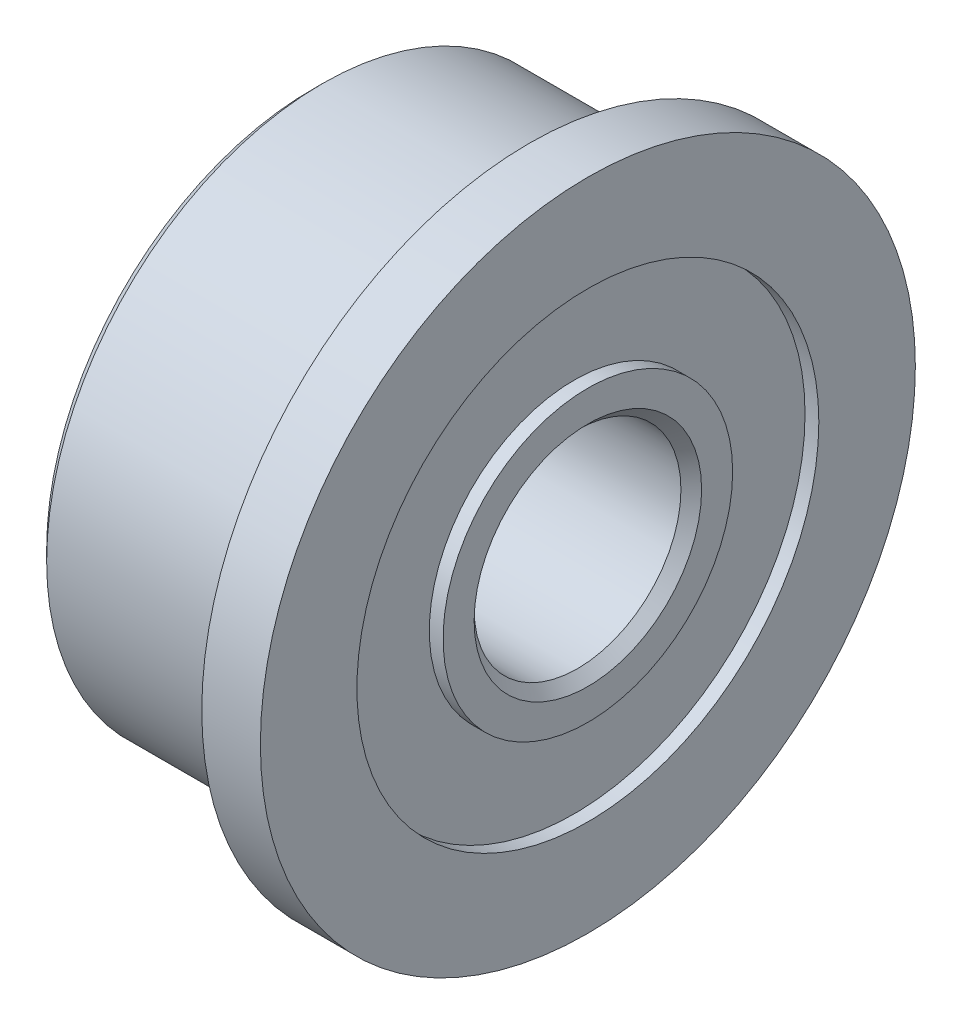
ISO-10303-21;
HEADER;
FILE_DESCRIPTION(('STEP AP214'),'2;1');
FILE_NAME('part.step','',(''),(''),'','','');
FILE_SCHEMA(('AUTOMOTIVE_DESIGN { 1 0 10303 214 1 1 1 1 }'));
ENDSEC;
DATA;
#1=APPLICATION_CONTEXT('core data for automotive mechanical design processes');
#2=APPLICATION_PROTOCOL_DEFINITION('international standard','automotive_design',2000,#1);
#3=PRODUCT_CONTEXT('',#1,'mechanical');
#4=PRODUCT('Part','Part','',(#3));
#5=PRODUCT_RELATED_PRODUCT_CATEGORY('part','',(#4));
#6=PRODUCT_DEFINITION_FORMATION('','',#4);
#7=PRODUCT_DEFINITION_CONTEXT('part definition',#1,'design');
#8=PRODUCT_DEFINITION('design','',#6,#7);
#9=PRODUCT_DEFINITION_SHAPE('','',#8);
#10=(LENGTH_UNIT() NAMED_UNIT(*) SI_UNIT(.MILLI.,.METRE.));
#11=(NAMED_UNIT(*) PLANE_ANGLE_UNIT() SI_UNIT($,.RADIAN.));
#12=(NAMED_UNIT(*) SI_UNIT($,.STERADIAN.) SOLID_ANGLE_UNIT());
#13=UNCERTAINTY_MEASURE_WITH_UNIT(LENGTH_MEASURE(1.E-05),#10,'distance_accuracy_value','');
#14=(GEOMETRIC_REPRESENTATION_CONTEXT(3) GLOBAL_UNCERTAINTY_ASSIGNED_CONTEXT((#13)) GLOBAL_UNIT_ASSIGNED_CONTEXT((#10,
#11,#12)) REPRESENTATION_CONTEXT('',''));
#15=CARTESIAN_POINT('',(0.,0.,0.));
#16=DIRECTION('',(0.,0.,1.));
#17=DIRECTION('',(1.,0.,0.));
#18=AXIS2_PLACEMENT_3D('',#15,#16,#17);
#19=CARTESIAN_POINT('',(-4.,2.1,0.));
#20=DIRECTION('',(-1.,0.,0.));
#21=DIRECTION('',(0.,0.,1.));
#22=AXIS2_PLACEMENT_3D('',#19,#20,#21);
#23=PLANE('',#22);
#24=CARTESIAN_POINT('',(-4.,0.,0.));
#25=DIRECTION('',(-1.,0.,0.));
#26=DIRECTION('',(0.,0.,1.));
#27=AXIS2_PLACEMENT_3D('',#24,#25,#26);
#28=CIRCLE('',#27,1.65);
#29=CARTESIAN_POINT('',(-4.,0.,1.65));
#30=VERTEX_POINT('',#29);
#31=EDGE_CURVE('E42',#30,#30,#28,.F.);
#32=ORIENTED_EDGE('',*,*,#31,.T.);
#33=EDGE_LOOP('',(#32));
#34=FACE_BOUND('',#33,.T.);
#35=CARTESIAN_POINT('',(-4.,0.,0.));
#36=DIRECTION('',(1.,0.,0.));
#37=DIRECTION('',(0.,0.,-1.));
#38=AXIS2_PLACEMENT_3D('',#35,#36,#37);
#39=CIRCLE('',#38,2.1);
#40=CARTESIAN_POINT('',(-4.,0.,-2.1));
#41=VERTEX_POINT('',#40);
#42=EDGE_CURVE('E90',#41,#41,#39,.T.);
#43=ORIENTED_EDGE('',*,*,#42,.F.);
#44=EDGE_LOOP('',(#43));
#45=FACE_BOUND('',#44,.T.);
#46=ADVANCED_FACE('F31',(#34,#45),#23,.T.);
#47=CARTESIAN_POINT('',(0.,0.,0.));
#48=DIRECTION('',(1.,0.,0.));
#49=DIRECTION('',(0.,0.,-1.));
#50=AXIS2_PLACEMENT_3D('',#47,#48,#49);
#51=CYLINDRICAL_SURFACE('',#50,1.5);
#52=CARTESIAN_POINT('',(-0.150000000000001,0.,0.));
#53=DIRECTION('',(1.,0.,0.));
#54=DIRECTION('',(0.,0.,-1.));
#55=AXIS2_PLACEMENT_3D('',#52,#53,#54);
#56=CIRCLE('',#55,1.5);
#57=CARTESIAN_POINT('',(-0.150000000000001,0.,-1.5));
#58=VERTEX_POINT('',#57);
#59=EDGE_CURVE('E51',#58,#58,#56,.T.);
#60=ORIENTED_EDGE('',*,*,#59,.T.);
#61=EDGE_LOOP('',(#60));
#62=FACE_BOUND('',#61,.T.);
#63=CARTESIAN_POINT('',(-3.85,0.,0.));
#64=DIRECTION('',(-1.,0.,0.));
#65=DIRECTION('',(0.,0.,1.));
#66=AXIS2_PLACEMENT_3D('',#63,#64,#65);
#67=CIRCLE('',#66,1.5);
#68=CARTESIAN_POINT('',(-3.85,0.,1.5));
#69=VERTEX_POINT('',#68);
#70=EDGE_CURVE('E54',#69,#69,#67,.T.);
#71=ORIENTED_EDGE('',*,*,#70,.T.);
#72=EDGE_LOOP('',(#71));
#73=FACE_BOUND('',#72,.T.);
#74=ADVANCED_FACE('F98',(#62,#73),#51,.F.);
#75=CARTESIAN_POINT('',(0.,1.5,0.));
#76=DIRECTION('',(1.,0.,0.));
#77=DIRECTION('',(0.,0.,-1.));
#78=AXIS2_PLACEMENT_3D('',#75,#76,#77);
#79=PLANE('',#78);
#80=CARTESIAN_POINT('',(0.,0.,0.));
#81=DIRECTION('',(1.,0.,0.));
#82=DIRECTION('',(0.,0.,-1.));
#83=AXIS2_PLACEMENT_3D('',#80,#81,#82);
#84=CIRCLE('',#83,1.65);
#85=CARTESIAN_POINT('',(0.,0.,-1.65));
#86=VERTEX_POINT('',#85);
#87=EDGE_CURVE('E46',#86,#86,#84,.F.);
#88=ORIENTED_EDGE('',*,*,#87,.T.);
#89=EDGE_LOOP('',(#88));
#90=FACE_BOUND('',#89,.T.);
#91=CARTESIAN_POINT('',(0.,0.,0.));
#92=DIRECTION('',(1.,0.,0.));
#93=DIRECTION('',(0.,0.,-1.));
#94=AXIS2_PLACEMENT_3D('',#91,#92,#93);
#95=CIRCLE('',#94,2.1);
#96=CARTESIAN_POINT('',(0.,0.,-2.1));
#97=VERTEX_POINT('',#96);
#98=EDGE_CURVE('E57',#97,#97,#95,.T.);
#99=ORIENTED_EDGE('',*,*,#98,.T.);
#100=EDGE_LOOP('',(#99));
#101=FACE_BOUND('',#100,.T.);
#102=ADVANCED_FACE('F104',(#90,#101),#79,.T.);
#103=CARTESIAN_POINT('',(0.,0.,0.));
#104=DIRECTION('',(1.,0.,0.));
#105=DIRECTION('',(0.,0.,-1.));
#106=AXIS2_PLACEMENT_3D('',#103,#104,#105);
#107=CYLINDRICAL_SURFACE('',#106,2.1);
#108=CARTESIAN_POINT('',(-0.2,0.,0.));
#109=DIRECTION('',(1.,0.,0.));
#110=DIRECTION('',(0.,0.,-1.));
#111=AXIS2_PLACEMENT_3D('',#108,#109,#110);
#112=CIRCLE('',#111,2.1);
#113=CARTESIAN_POINT('',(-0.2,0.,-2.1));
#114=VERTEX_POINT('',#113);
#115=EDGE_CURVE('E60',#114,#114,#112,.T.);
#116=ORIENTED_EDGE('',*,*,#115,.T.);
#117=EDGE_LOOP('',(#116));
#118=FACE_BOUND('',#117,.T.);
#119=ORIENTED_EDGE('',*,*,#98,.F.);
#120=EDGE_LOOP('',(#119));
#121=FACE_BOUND('',#120,.T.);
#122=ADVANCED_FACE('F171',(#118,#121),#107,.T.);
#123=CARTESIAN_POINT('',(-0.2,3.35,0.));
#124=DIRECTION('',(1.,0.,0.));
#125=DIRECTION('',(0.,0.,-1.));
#126=AXIS2_PLACEMENT_3D('',#123,#124,#125);
#127=PLANE('',#126);
#128=CARTESIAN_POINT('',(-0.2,0.,0.));
#129=DIRECTION('',(1.,0.,0.));
#130=DIRECTION('',(0.,0.,-1.));
#131=AXIS2_PLACEMENT_3D('',#128,#129,#130);
#132=CIRCLE('',#131,3.35);
#133=CARTESIAN_POINT('',(-0.2,0.,-3.35));
#134=VERTEX_POINT('',#133);
#135=EDGE_CURVE('E63',#134,#134,#132,.T.);
#136=ORIENTED_EDGE('',*,*,#135,.T.);
#137=EDGE_LOOP('',(#136));
#138=FACE_BOUND('',#137,.T.);
#139=ORIENTED_EDGE('',*,*,#115,.F.);
#140=EDGE_LOOP('',(#139));
#141=FACE_BOUND('',#140,.T.);
#142=ADVANCED_FACE('F253',(#138,#141),#127,.T.);
#143=CARTESIAN_POINT('',(0.,0.,0.));
#144=DIRECTION('',(1.,0.,0.));
#145=DIRECTION('',(0.,0.,-1.));
#146=AXIS2_PLACEMENT_3D('',#143,#144,#145);
#147=CYLINDRICAL_SURFACE('',#146,3.35);
#148=CARTESIAN_POINT('',(0.,0.,0.));
#149=DIRECTION('',(1.,0.,0.));
#150=DIRECTION('',(0.,0.,-1.));
#151=AXIS2_PLACEMENT_3D('',#148,#149,#150);
#152=CIRCLE('',#151,3.35);
#153=CARTESIAN_POINT('',(0.,0.,-3.35));
#154=VERTEX_POINT('',#153);
#155=EDGE_CURVE('E66',#154,#154,#152,.T.);
#156=ORIENTED_EDGE('',*,*,#155,.T.);
#157=EDGE_LOOP('',(#156));
#158=FACE_BOUND('',#157,.T.);
#159=ORIENTED_EDGE('',*,*,#135,.F.);
#160=EDGE_LOOP('',(#159));
#161=FACE_BOUND('',#160,.T.);
#162=ADVANCED_FACE('F243',(#158,#161),#147,.F.);
#163=CARTESIAN_POINT('',(0.,3.35,0.));
#164=DIRECTION('',(1.,0.,0.));
#165=DIRECTION('',(0.,0.,-1.));
#166=AXIS2_PLACEMENT_3D('',#163,#164,#165);
#167=PLANE('',#166);
#168=CARTESIAN_POINT('',(0.,0.,0.));
#169=DIRECTION('',(1.,0.,0.));
#170=DIRECTION('',(0.,0.,-1.));
#171=AXIS2_PLACEMENT_3D('',#168,#169,#170);
#172=CIRCLE('',#171,4.75);
#173=CARTESIAN_POINT('',(0.,0.,-4.75));
#174=VERTEX_POINT('',#173);
#175=EDGE_CURVE('E69',#174,#174,#172,.T.);
#176=ORIENTED_EDGE('',*,*,#175,.T.);
#177=EDGE_LOOP('',(#176));
#178=FACE_BOUND('',#177,.T.);
#179=ORIENTED_EDGE('',*,*,#155,.F.);
#180=EDGE_LOOP('',(#179));
#181=FACE_BOUND('',#180,.T.);
#182=ADVANCED_FACE('F233',(#178,#181),#167,.T.);
#183=CARTESIAN_POINT('',(0.,0.,0.));
#184=DIRECTION('',(1.,0.,0.));
#185=DIRECTION('',(0.,0.,-1.));
#186=AXIS2_PLACEMENT_3D('',#183,#184,#185);
#187=CYLINDRICAL_SURFACE('',#186,4.75);
#188=CARTESIAN_POINT('',(-0.85,0.,0.));
#189=DIRECTION('',(1.,0.,0.));
#190=DIRECTION('',(0.,0.,-1.));
#191=AXIS2_PLACEMENT_3D('',#188,#189,#190);
#192=CIRCLE('',#191,4.75);
#193=CARTESIAN_POINT('',(-0.85,0.,-4.75));
#194=VERTEX_POINT('',#193);
#195=EDGE_CURVE('E72',#194,#194,#192,.T.);
#196=ORIENTED_EDGE('',*,*,#195,.T.);
#197=EDGE_LOOP('',(#196));
#198=FACE_BOUND('',#197,.T.);
#199=ORIENTED_EDGE('',*,*,#175,.F.);
#200=EDGE_LOOP('',(#199));
#201=FACE_BOUND('',#200,.T.);
#202=ADVANCED_FACE('F223',(#198,#201),#187,.T.);
#203=CARTESIAN_POINT('',(-0.85,4.75,0.));
#204=DIRECTION('',(-1.,0.,0.));
#205=DIRECTION('',(0.,0.,1.));
#206=AXIS2_PLACEMENT_3D('',#203,#204,#205);
#207=PLANE('',#206);
#208=CARTESIAN_POINT('',(-0.85,0.,0.));
#209=DIRECTION('',(1.,0.,0.));
#210=DIRECTION('',(0.,0.,-1.));
#211=AXIS2_PLACEMENT_3D('',#208,#209,#210);
#212=CIRCLE('',#211,4.02);
#213=CARTESIAN_POINT('',(-0.85,0.,-4.02));
#214=VERTEX_POINT('',#213);
#215=EDGE_CURVE('E75',#214,#214,#212,.T.);
#216=ORIENTED_EDGE('',*,*,#215,.T.);
#217=EDGE_LOOP('',(#216));
#218=FACE_BOUND('',#217,.T.);
#219=ORIENTED_EDGE('',*,*,#195,.F.);
#220=EDGE_LOOP('',(#219));
#221=FACE_BOUND('',#220,.T.);
#222=ADVANCED_FACE('F213',(#218,#221),#207,.T.);
#223=CARTESIAN_POINT('',(-0.85,0.,0.));
#224=DIRECTION('',(1.,0.,0.));
#225=DIRECTION('',(0.,0.,-1.));
#226=AXIS2_PLACEMENT_3D('',#223,#224,#225);
#227=TOROIDAL_SURFACE('',#226,4.,0.0200000000000001);
#228=CARTESIAN_POINT('',(-0.87,0.,0.));
#229=DIRECTION('',(1.,0.,0.));
#230=DIRECTION('',(0.,0.,-1.));
#231=AXIS2_PLACEMENT_3D('',#228,#229,#230);
#232=CIRCLE('',#231,4.);
#233=CARTESIAN_POINT('',(-0.87,0.,-4.));
#234=VERTEX_POINT('',#233);
#235=EDGE_CURVE('E78',#234,#234,#232,.T.);
#236=ORIENTED_EDGE('',*,*,#235,.T.);
#237=EDGE_LOOP('',(#236));
#238=FACE_BOUND('',#237,.T.);
#239=ORIENTED_EDGE('',*,*,#215,.F.);
#240=EDGE_LOOP('',(#239));
#241=FACE_BOUND('',#240,.T.);
#242=ADVANCED_FACE('F160',(#238,#241),#227,.F.);
#243=CARTESIAN_POINT('',(0.,0.,0.));
#244=DIRECTION('',(1.,0.,0.));
#245=DIRECTION('',(0.,0.,-1.));
#246=AXIS2_PLACEMENT_3D('',#243,#244,#245);
#247=CYLINDRICAL_SURFACE('',#246,4.);
#248=CARTESIAN_POINT('',(-3.85,0.,0.));
#249=DIRECTION('',(-1.,0.,0.));
#250=DIRECTION('',(0.,0.,1.));
#251=AXIS2_PLACEMENT_3D('',#248,#249,#250);
#252=CIRCLE('',#251,4.);
#253=CARTESIAN_POINT('',(-3.85,0.,4.));
#254=VERTEX_POINT('',#253);
#255=EDGE_CURVE('E38',#254,#254,#252,.F.);
#256=ORIENTED_EDGE('',*,*,#255,.T.);
#257=EDGE_LOOP('',(#256));
#258=FACE_BOUND('',#257,.T.);
#259=ORIENTED_EDGE('',*,*,#235,.F.);
#260=EDGE_LOOP('',(#259));
#261=FACE_BOUND('',#260,.T.);
#262=ADVANCED_FACE('F149',(#258,#261),#247,.T.);
#263=CARTESIAN_POINT('',(-4.,4.,0.));
#264=DIRECTION('',(-1.,0.,0.));
#265=DIRECTION('',(0.,0.,1.));
#266=AXIS2_PLACEMENT_3D('',#263,#264,#265);
#267=PLANE('',#266);
#268=CARTESIAN_POINT('',(-4.,0.,0.));
#269=DIRECTION('',(-1.,0.,0.));
#270=DIRECTION('',(0.,0.,1.));
#271=AXIS2_PLACEMENT_3D('',#268,#269,#270);
#272=CIRCLE('',#271,3.85);
#273=CARTESIAN_POINT('',(-4.,0.,3.85));
#274=VERTEX_POINT('',#273);
#275=EDGE_CURVE('E10',#274,#274,#272,.T.);
#276=ORIENTED_EDGE('',*,*,#275,.T.);
#277=EDGE_LOOP('',(#276));
#278=FACE_BOUND('',#277,.T.);
#279=CARTESIAN_POINT('',(-4.,0.,0.));
#280=DIRECTION('',(1.,0.,0.));
#281=DIRECTION('',(0.,0.,-1.));
#282=AXIS2_PLACEMENT_3D('',#279,#280,#281);
#283=CIRCLE('',#282,3.35);
#284=CARTESIAN_POINT('',(-4.,0.,-3.35));
#285=VERTEX_POINT('',#284);
#286=EDGE_CURVE('E81',#285,#285,#283,.T.);
#287=ORIENTED_EDGE('',*,*,#286,.T.);
#288=EDGE_LOOP('',(#287));
#289=FACE_BOUND('',#288,.T.);
#290=ADVANCED_FACE('F143',(#278,#289),#267,.T.);
#291=CARTESIAN_POINT('',(0.,0.,0.));
#292=DIRECTION('',(1.,0.,0.));
#293=DIRECTION('',(0.,0.,-1.));
#294=AXIS2_PLACEMENT_3D('',#291,#292,#293);
#295=CYLINDRICAL_SURFACE('',#294,3.35);
#296=CARTESIAN_POINT('',(-3.8,0.,0.));
#297=DIRECTION('',(1.,0.,0.));
#298=DIRECTION('',(0.,0.,-1.));
#299=AXIS2_PLACEMENT_3D('',#296,#297,#298);
#300=CIRCLE('',#299,3.35);
#301=CARTESIAN_POINT('',(-3.8,0.,-3.35));
#302=VERTEX_POINT('',#301);
#303=EDGE_CURVE('E84',#302,#302,#300,.T.);
#304=ORIENTED_EDGE('',*,*,#303,.T.);
#305=EDGE_LOOP('',(#304));
#306=FACE_BOUND('',#305,.T.);
#307=ORIENTED_EDGE('',*,*,#286,.F.);
#308=EDGE_LOOP('',(#307));
#309=FACE_BOUND('',#308,.T.);
#310=ADVANCED_FACE('F148',(#306,#309),#295,.F.);
#311=CARTESIAN_POINT('',(-3.8,3.35,0.));
#312=DIRECTION('',(-1.,0.,0.));
#313=DIRECTION('',(0.,0.,1.));
#314=AXIS2_PLACEMENT_3D('',#311,#312,#313);
#315=PLANE('',#314);
#316=CARTESIAN_POINT('',(-3.8,0.,0.));
#317=DIRECTION('',(1.,0.,0.));
#318=DIRECTION('',(0.,0.,-1.));
#319=AXIS2_PLACEMENT_3D('',#316,#317,#318);
#320=CIRCLE('',#319,2.1);
#321=CARTESIAN_POINT('',(-3.8,0.,-2.1));
#322=VERTEX_POINT('',#321);
#323=EDGE_CURVE('E87',#322,#322,#320,.T.);
#324=ORIENTED_EDGE('',*,*,#323,.T.);
#325=EDGE_LOOP('',(#324));
#326=FACE_BOUND('',#325,.T.);
#327=ORIENTED_EDGE('',*,*,#303,.F.);
#328=EDGE_LOOP('',(#327));
#329=FACE_BOUND('',#328,.T.);
#330=ADVANCED_FACE('F190',(#326,#329),#315,.T.);
#331=CARTESIAN_POINT('',(0.,0.,0.));
#332=DIRECTION('',(1.,0.,0.));
#333=DIRECTION('',(0.,0.,-1.));
#334=AXIS2_PLACEMENT_3D('',#331,#332,#333);
#335=CYLINDRICAL_SURFACE('',#334,2.1);
#336=ORIENTED_EDGE('',*,*,#42,.T.);
#337=EDGE_LOOP('',(#336));
#338=FACE_BOUND('',#337,.T.);
#339=ORIENTED_EDGE('',*,*,#323,.F.);
#340=EDGE_LOOP('',(#339));
#341=FACE_BOUND('',#340,.T.);
#342=ADVANCED_FACE('F94',(#338,#341),#335,.T.);
#343=CARTESIAN_POINT('',(-0.150000000000001,0.,0.));
#344=DIRECTION('',(1.,0.,0.));
#345=DIRECTION('',(0.,0.,-1.));
#346=AXIS2_PLACEMENT_3D('',#343,#344,#345);
#347=CONICAL_SURFACE('',#346,1.5,0.785398163397448);
#348=ORIENTED_EDGE('',*,*,#87,.F.);
#349=EDGE_LOOP('',(#348));
#350=FACE_BOUND('',#349,.T.);
#351=ORIENTED_EDGE('',*,*,#59,.F.);
#352=EDGE_LOOP('',(#351));
#353=FACE_BOUND('',#352,.T.);
#354=ADVANCED_FACE('F109',(#350,#353),#347,.F.);
#355=CARTESIAN_POINT('',(-4.,0.,0.));
#356=DIRECTION('',(-1.,0.,0.));
#357=DIRECTION('',(0.,0.,1.));
#358=AXIS2_PLACEMENT_3D('',#355,#356,#357);
#359=CONICAL_SURFACE('',#358,1.65,0.785398163397448);
#360=ORIENTED_EDGE('',*,*,#70,.F.);
#361=EDGE_LOOP('',(#360));
#362=FACE_BOUND('',#361,.T.);
#363=ORIENTED_EDGE('',*,*,#31,.F.);
#364=EDGE_LOOP('',(#363));
#365=FACE_BOUND('',#364,.T.);
#366=ADVANCED_FACE('F111',(#362,#365),#359,.F.);
#367=CARTESIAN_POINT('',(-3.85,0.,0.));
#368=DIRECTION('',(1.,0.,0.));
#369=DIRECTION('',(0.,0.,-1.));
#370=AXIS2_PLACEMENT_3D('',#367,#368,#369);
#371=CONICAL_SURFACE('',#370,4.,0.785398163397451);
#372=ORIENTED_EDGE('',*,*,#275,.F.);
#373=EDGE_LOOP('',(#372));
#374=FACE_BOUND('',#373,.T.);
#375=ORIENTED_EDGE('',*,*,#255,.F.);
#376=EDGE_LOOP('',(#375));
#377=FACE_BOUND('',#376,.T.);
#378=ADVANCED_FACE('F33',(#374,#377),#371,.T.);
#379=CLOSED_SHELL('',(#46,#74,#102,#122,#142,#162,#182,#202,#222,#242,#262,#290,#310,#330,#342,
#354,#366,#378));
#380=MANIFOLD_SOLID_BREP('B2',#379);
#381=ADVANCED_BREP_SHAPE_REPRESENTATION('',(#18,#380),#14);
#382=SHAPE_DEFINITION_REPRESENTATION(#9,#381);
ENDSEC;
END-ISO-10303-21;
